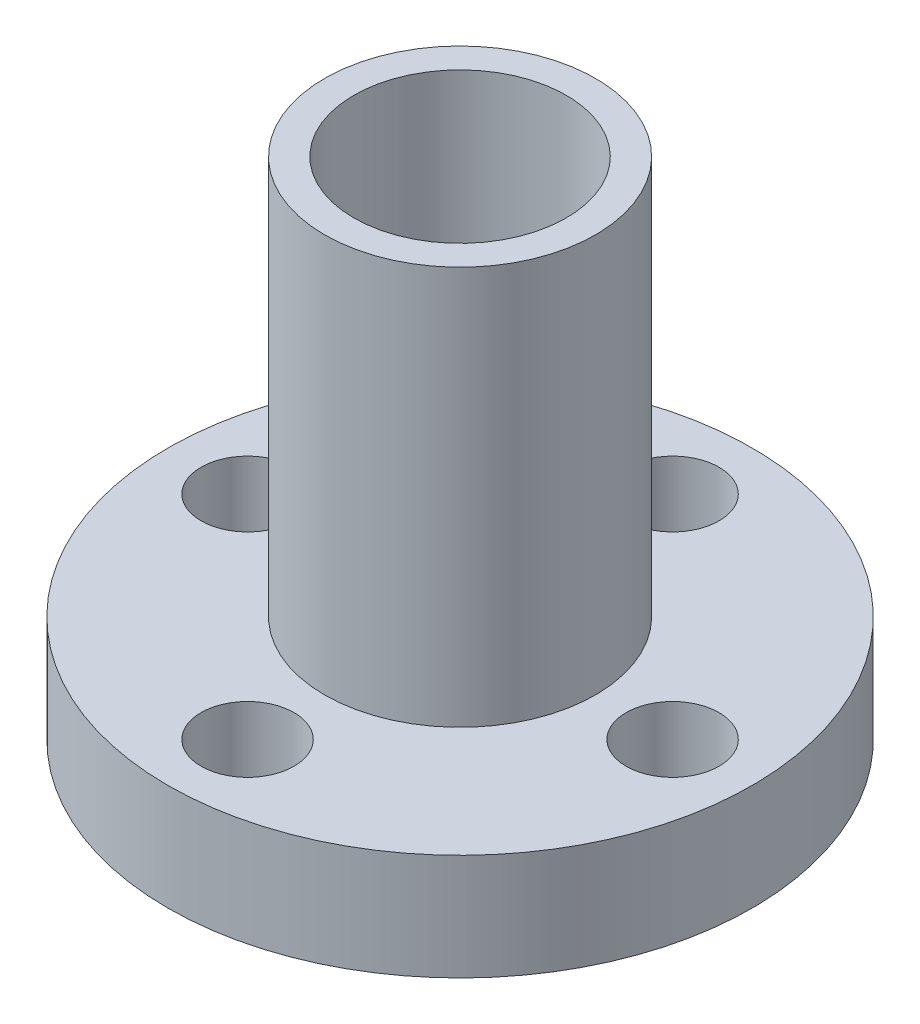
ISO-10303-21;
HEADER;
FILE_DESCRIPTION(('STEP AP214'),'2;1');
FILE_NAME('part.step','',(''),(''),'','','');
FILE_SCHEMA(('AUTOMOTIVE_DESIGN { 1 0 10303 214 1 1 1 1 }'));
ENDSEC;
DATA;
#1=APPLICATION_CONTEXT('core data for automotive mechanical design processes');
#2=APPLICATION_PROTOCOL_DEFINITION('international standard','automotive_design',2000,#1);
#3=PRODUCT_CONTEXT('',#1,'mechanical');
#4=PRODUCT('Part','Part','',(#3));
#5=PRODUCT_RELATED_PRODUCT_CATEGORY('part','',(#4));
#6=PRODUCT_DEFINITION_FORMATION('','',#4);
#7=PRODUCT_DEFINITION_CONTEXT('part definition',#1,'design');
#8=PRODUCT_DEFINITION('design','',#6,#7);
#9=PRODUCT_DEFINITION_SHAPE('','',#8);
#10=(LENGTH_UNIT() NAMED_UNIT(*) SI_UNIT(.MILLI.,.METRE.));
#11=(NAMED_UNIT(*) PLANE_ANGLE_UNIT() SI_UNIT($,.RADIAN.));
#12=(NAMED_UNIT(*) SI_UNIT($,.STERADIAN.) SOLID_ANGLE_UNIT());
#13=UNCERTAINTY_MEASURE_WITH_UNIT(LENGTH_MEASURE(1.E-05),#10,'distance_accuracy_value','');
#14=(GEOMETRIC_REPRESENTATION_CONTEXT(3) GLOBAL_UNCERTAINTY_ASSIGNED_CONTEXT((#13)) GLOBAL_UNIT_ASSIGNED_CONTEXT((#10,
#11,#12)) REPRESENTATION_CONTEXT('',''));
#15=CARTESIAN_POINT('',(0.,0.,0.));
#16=DIRECTION('',(0.,0.,1.));
#17=DIRECTION('',(1.,0.,0.));
#18=AXIS2_PLACEMENT_3D('',#15,#16,#17);
#19=CARTESIAN_POINT('',(0.,4.,0.));
#20=DIRECTION('',(0.,-1.,0.));
#21=DIRECTION('',(0.,0.,-1.));
#22=AXIS2_PLACEMENT_3D('',#19,#20,#21);
#23=CYLINDRICAL_SURFACE('',#22,11.);
#24=CARTESIAN_POINT('',(0.,4.,0.));
#25=DIRECTION('',(0.,1.,0.));
#26=DIRECTION('',(0.,0.,1.));
#27=AXIS2_PLACEMENT_3D('',#24,#25,#26);
#28=CIRCLE('',#27,11.);
#29=CARTESIAN_POINT('',(0.,4.,11.));
#30=VERTEX_POINT('',#29);
#31=EDGE_CURVE('E45',#30,#30,#28,.T.);
#32=ORIENTED_EDGE('',*,*,#31,.F.);
#33=EDGE_LOOP('',(#32));
#34=FACE_BOUND('',#33,.T.);
#35=CARTESIAN_POINT('',(0.,0.,0.));
#36=DIRECTION('',(0.,1.,0.));
#37=DIRECTION('',(0.,0.,1.));
#38=AXIS2_PLACEMENT_3D('',#35,#36,#37);
#39=CIRCLE('',#38,11.);
#40=CARTESIAN_POINT('',(0.,0.,11.));
#41=VERTEX_POINT('',#40);
#42=EDGE_CURVE('E40',#41,#41,#39,.T.);
#43=ORIENTED_EDGE('',*,*,#42,.T.);
#44=EDGE_LOOP('',(#43));
#45=FACE_BOUND('',#44,.T.);
#46=ADVANCED_FACE('F37',(#34,#45),#23,.T.);
#47=CARTESIAN_POINT('',(0.,4.,0.));
#48=DIRECTION('',(0.,1.,0.));
#49=DIRECTION('',(0.,0.,1.));
#50=AXIS2_PLACEMENT_3D('',#47,#48,#49);
#51=PLANE('',#50);
#52=CARTESIAN_POINT('',(0.,4.,-8.));
#53=DIRECTION('',(0.,1.,0.));
#54=DIRECTION('',(0.,0.,1.));
#55=AXIS2_PLACEMENT_3D('',#52,#53,#54);
#56=CIRCLE('',#55,1.75);
#57=CARTESIAN_POINT('',(0.,4.,-6.25));
#58=VERTEX_POINT('',#57);
#59=EDGE_CURVE('E89',#58,#58,#56,.T.);
#60=ORIENTED_EDGE('',*,*,#59,.F.);
#61=EDGE_LOOP('',(#60));
#62=FACE_BOUND('',#61,.T.);
#63=CARTESIAN_POINT('',(0.,4.,8.));
#64=DIRECTION('',(0.,1.,0.));
#65=DIRECTION('',(0.,0.,1.));
#66=AXIS2_PLACEMENT_3D('',#63,#64,#65);
#67=CIRCLE('',#66,1.75);
#68=CARTESIAN_POINT('',(0.,4.,9.75));
#69=VERTEX_POINT('',#68);
#70=EDGE_CURVE('E81',#69,#69,#67,.T.);
#71=ORIENTED_EDGE('',*,*,#70,.F.);
#72=EDGE_LOOP('',(#71));
#73=FACE_BOUND('',#72,.T.);
#74=CARTESIAN_POINT('',(-8.,4.,0.));
#75=DIRECTION('',(0.,1.,0.));
#76=DIRECTION('',(0.,0.,1.));
#77=AXIS2_PLACEMENT_3D('',#74,#75,#76);
#78=CIRCLE('',#77,1.75);
#79=CARTESIAN_POINT('',(-8.,4.,1.75));
#80=VERTEX_POINT('',#79);
#81=EDGE_CURVE('E73',#80,#80,#78,.T.);
#82=ORIENTED_EDGE('',*,*,#81,.F.);
#83=EDGE_LOOP('',(#82));
#84=FACE_BOUND('',#83,.T.);
#85=CARTESIAN_POINT('',(8.,4.,0.));
#86=DIRECTION('',(0.,1.,0.));
#87=DIRECTION('',(0.,0.,1.));
#88=AXIS2_PLACEMENT_3D('',#85,#86,#87);
#89=CIRCLE('',#88,1.75);
#90=CARTESIAN_POINT('',(8.,4.,1.75));
#91=VERTEX_POINT('',#90);
#92=EDGE_CURVE('E65',#91,#91,#89,.T.);
#93=ORIENTED_EDGE('',*,*,#92,.F.);
#94=EDGE_LOOP('',(#93));
#95=FACE_BOUND('',#94,.T.);
#96=CARTESIAN_POINT('',(0.,4.,0.));
#97=DIRECTION('',(0.,1.,0.));
#98=DIRECTION('',(0.,0.,1.));
#99=AXIS2_PLACEMENT_3D('',#96,#97,#98);
#100=CIRCLE('',#99,5.1);
#101=CARTESIAN_POINT('',(0.,4.,5.1));
#102=VERTEX_POINT('',#101);
#103=EDGE_CURVE('E10',#102,#102,#100,.T.);
#104=ORIENTED_EDGE('',*,*,#103,.F.);
#105=EDGE_LOOP('',(#104));
#106=FACE_BOUND('',#105,.T.);
#107=ORIENTED_EDGE('',*,*,#31,.T.);
#108=EDGE_LOOP('',(#107));
#109=FACE_BOUND('',#108,.T.);
#110=ADVANCED_FACE('F107',(#62,#73,#84,#95,#106,#109),#51,.T.);
#111=CARTESIAN_POINT('',(0.,0.,0.));
#112=DIRECTION('',(0.,1.,0.));
#113=DIRECTION('',(0.,0.,1.));
#114=AXIS2_PLACEMENT_3D('',#111,#112,#113);
#115=PLANE('',#114);
#116=CARTESIAN_POINT('',(0.,0.,-8.));
#117=DIRECTION('',(0.,1.,0.));
#118=DIRECTION('',(0.,0.,1.));
#119=AXIS2_PLACEMENT_3D('',#116,#117,#118);
#120=CIRCLE('',#119,1.75);
#121=CARTESIAN_POINT('',(0.,0.,-6.25));
#122=VERTEX_POINT('',#121);
#123=EDGE_CURVE('E61',#122,#122,#120,.T.);
#124=ORIENTED_EDGE('',*,*,#123,.T.);
#125=EDGE_LOOP('',(#124));
#126=FACE_BOUND('',#125,.T.);
#127=CARTESIAN_POINT('',(0.,0.,8.));
#128=DIRECTION('',(0.,1.,0.));
#129=DIRECTION('',(0.,0.,1.));
#130=AXIS2_PLACEMENT_3D('',#127,#128,#129);
#131=CIRCLE('',#130,1.75);
#132=CARTESIAN_POINT('',(0.,0.,9.75));
#133=VERTEX_POINT('',#132);
#134=EDGE_CURVE('E85',#133,#133,#131,.T.);
#135=ORIENTED_EDGE('',*,*,#134,.T.);
#136=EDGE_LOOP('',(#135));
#137=FACE_BOUND('',#136,.T.);
#138=CARTESIAN_POINT('',(-8.,0.,0.));
#139=DIRECTION('',(0.,1.,0.));
#140=DIRECTION('',(0.,0.,1.));
#141=AXIS2_PLACEMENT_3D('',#138,#139,#140);
#142=CIRCLE('',#141,1.75);
#143=CARTESIAN_POINT('',(-8.,0.,1.75));
#144=VERTEX_POINT('',#143);
#145=EDGE_CURVE('E77',#144,#144,#142,.T.);
#146=ORIENTED_EDGE('',*,*,#145,.T.);
#147=EDGE_LOOP('',(#146));
#148=FACE_BOUND('',#147,.T.);
#149=CARTESIAN_POINT('',(8.,0.,0.));
#150=DIRECTION('',(0.,1.,0.));
#151=DIRECTION('',(0.,0.,1.));
#152=AXIS2_PLACEMENT_3D('',#149,#150,#151);
#153=CIRCLE('',#152,1.75);
#154=CARTESIAN_POINT('',(8.,0.,1.75));
#155=VERTEX_POINT('',#154);
#156=EDGE_CURVE('E69',#155,#155,#153,.T.);
#157=ORIENTED_EDGE('',*,*,#156,.T.);
#158=EDGE_LOOP('',(#157));
#159=FACE_BOUND('',#158,.T.);
#160=CARTESIAN_POINT('',(0.,0.,0.));
#161=DIRECTION('',(0.,1.,0.));
#162=DIRECTION('',(0.,0.,1.));
#163=AXIS2_PLACEMENT_3D('',#160,#161,#162);
#164=CIRCLE('',#163,4.);
#165=CARTESIAN_POINT('',(0.,0.,4.));
#166=VERTEX_POINT('',#165);
#167=EDGE_CURVE('E56',#166,#166,#164,.T.);
#168=ORIENTED_EDGE('',*,*,#167,.T.);
#169=EDGE_LOOP('',(#168));
#170=FACE_BOUND('',#169,.T.);
#171=ORIENTED_EDGE('',*,*,#42,.F.);
#172=EDGE_LOOP('',(#171));
#173=FACE_BOUND('',#172,.T.);
#174=ADVANCED_FACE('F97',(#126,#137,#148,#159,#170,#173),#115,.F.);
#175=CARTESIAN_POINT('',(0.,19.,0.));
#176=DIRECTION('',(0.,-1.,0.));
#177=DIRECTION('',(0.,0.,-1.));
#178=AXIS2_PLACEMENT_3D('',#175,#176,#177);
#179=CYLINDRICAL_SURFACE('',#178,5.1);
#180=CARTESIAN_POINT('',(0.,19.,0.));
#181=DIRECTION('',(0.,1.,0.));
#182=DIRECTION('',(0.,0.,1.));
#183=AXIS2_PLACEMENT_3D('',#180,#181,#182);
#184=CIRCLE('',#183,5.1);
#185=CARTESIAN_POINT('',(0.,19.,5.1));
#186=VERTEX_POINT('',#185);
#187=EDGE_CURVE('E52',#186,#186,#184,.T.);
#188=ORIENTED_EDGE('',*,*,#187,.F.);
#189=EDGE_LOOP('',(#188));
#190=FACE_BOUND('',#189,.T.);
#191=ORIENTED_EDGE('',*,*,#103,.T.);
#192=EDGE_LOOP('',(#191));
#193=FACE_BOUND('',#192,.T.);
#194=ADVANCED_FACE('F127',(#190,#193),#179,.T.);
#195=CARTESIAN_POINT('',(0.,19.,0.));
#196=DIRECTION('',(0.,1.,0.));
#197=DIRECTION('',(0.,0.,1.));
#198=AXIS2_PLACEMENT_3D('',#195,#196,#197);
#199=PLANE('',#198);
#200=CARTESIAN_POINT('',(0.,19.,0.));
#201=DIRECTION('',(0.,1.,0.));
#202=DIRECTION('',(0.,0.,1.));
#203=AXIS2_PLACEMENT_3D('',#200,#201,#202);
#204=CIRCLE('',#203,4.);
#205=CARTESIAN_POINT('',(0.,19.,4.));
#206=VERTEX_POINT('',#205);
#207=EDGE_CURVE('E57',#206,#206,#204,.T.);
#208=ORIENTED_EDGE('',*,*,#207,.F.);
#209=EDGE_LOOP('',(#208));
#210=FACE_BOUND('',#209,.T.);
#211=ORIENTED_EDGE('',*,*,#187,.T.);
#212=EDGE_LOOP('',(#211));
#213=FACE_BOUND('',#212,.T.);
#214=ADVANCED_FACE('F131',(#210,#213),#199,.T.);
#215=CARTESIAN_POINT('',(0.,0.,0.));
#216=DIRECTION('',(0.,1.,0.));
#217=DIRECTION('',(0.,0.,1.));
#218=AXIS2_PLACEMENT_3D('',#215,#216,#217);
#219=CYLINDRICAL_SURFACE('',#218,4.);
#220=ORIENTED_EDGE('',*,*,#167,.F.);
#221=EDGE_LOOP('',(#220));
#222=FACE_BOUND('',#221,.T.);
#223=ORIENTED_EDGE('',*,*,#207,.T.);
#224=EDGE_LOOP('',(#223));
#225=FACE_BOUND('',#224,.T.);
#226=ADVANCED_FACE('F137',(#222,#225),#219,.F.);
#227=CARTESIAN_POINT('',(8.,0.,0.));
#228=DIRECTION('',(0.,1.,0.));
#229=DIRECTION('',(0.,0.,1.));
#230=AXIS2_PLACEMENT_3D('',#227,#228,#229);
#231=CYLINDRICAL_SURFACE('',#230,1.75);
#232=ORIENTED_EDGE('',*,*,#156,.F.);
#233=EDGE_LOOP('',(#232));
#234=FACE_BOUND('',#233,.T.);
#235=ORIENTED_EDGE('',*,*,#92,.T.);
#236=EDGE_LOOP('',(#235));
#237=FACE_BOUND('',#236,.T.);
#238=ADVANCED_FACE('F141',(#234,#237),#231,.F.);
#239=CARTESIAN_POINT('',(-8.,0.,0.));
#240=DIRECTION('',(0.,1.,0.));
#241=DIRECTION('',(0.,0.,1.));
#242=AXIS2_PLACEMENT_3D('',#239,#240,#241);
#243=CYLINDRICAL_SURFACE('',#242,1.75);
#244=ORIENTED_EDGE('',*,*,#145,.F.);
#245=EDGE_LOOP('',(#244));
#246=FACE_BOUND('',#245,.T.);
#247=ORIENTED_EDGE('',*,*,#81,.T.);
#248=EDGE_LOOP('',(#247));
#249=FACE_BOUND('',#248,.T.);
#250=ADVANCED_FACE('F145',(#246,#249),#243,.F.);
#251=CARTESIAN_POINT('',(0.,0.,8.));
#252=DIRECTION('',(0.,1.,0.));
#253=DIRECTION('',(0.,0.,1.));
#254=AXIS2_PLACEMENT_3D('',#251,#252,#253);
#255=CYLINDRICAL_SURFACE('',#254,1.75);
#256=ORIENTED_EDGE('',*,*,#134,.F.);
#257=EDGE_LOOP('',(#256));
#258=FACE_BOUND('',#257,.T.);
#259=ORIENTED_EDGE('',*,*,#70,.T.);
#260=EDGE_LOOP('',(#259));
#261=FACE_BOUND('',#260,.T.);
#262=ADVANCED_FACE('F103',(#258,#261),#255,.F.);
#263=CARTESIAN_POINT('',(0.,0.,-8.));
#264=DIRECTION('',(0.,1.,0.));
#265=DIRECTION('',(0.,0.,1.));
#266=AXIS2_PLACEMENT_3D('',#263,#264,#265);
#267=CYLINDRICAL_SURFACE('',#266,1.75);
#268=ORIENTED_EDGE('',*,*,#123,.F.);
#269=EDGE_LOOP('',(#268));
#270=FACE_BOUND('',#269,.T.);
#271=ORIENTED_EDGE('',*,*,#59,.T.);
#272=EDGE_LOOP('',(#271));
#273=FACE_BOUND('',#272,.T.);
#274=ADVANCED_FACE('F100',(#270,#273),#267,.F.);
#275=CLOSED_SHELL('',(#46,#110,#174,#194,#214,#226,#238,#250,#262,#274));
#276=MANIFOLD_SOLID_BREP('B2',#275);
#277=ADVANCED_BREP_SHAPE_REPRESENTATION('',(#18,#276),#14);
#278=SHAPE_DEFINITION_REPRESENTATION(#9,#277);
ENDSEC;
END-ISO-10303-21;
